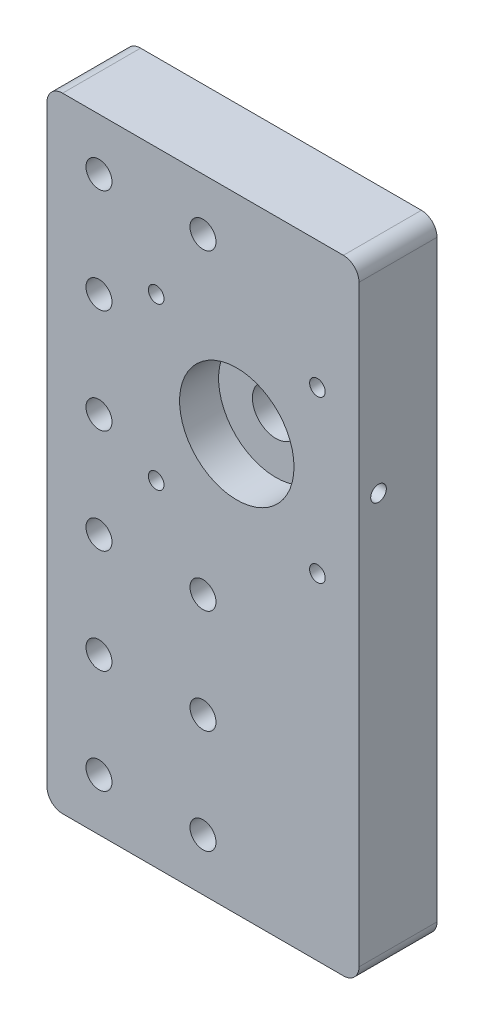
ISO-10303-21;
HEADER;
FILE_DESCRIPTION(('STEP AP214'),'2;1');
FILE_NAME('part.step','',(''),(''),'','','');
FILE_SCHEMA(('AUTOMOTIVE_DESIGN { 1 0 10303 214 1 1 1 1 }'));
ENDSEC;
DATA;
#1=APPLICATION_CONTEXT('core data for automotive mechanical design processes');
#2=APPLICATION_PROTOCOL_DEFINITION('international standard','automotive_design',2000,#1);
#3=PRODUCT_CONTEXT('',#1,'mechanical');
#4=PRODUCT('Part','Part','',(#3));
#5=PRODUCT_RELATED_PRODUCT_CATEGORY('part','',(#4));
#6=PRODUCT_DEFINITION_FORMATION('','',#4);
#7=PRODUCT_DEFINITION_CONTEXT('part definition',#1,'design');
#8=PRODUCT_DEFINITION('design','',#6,#7);
#9=PRODUCT_DEFINITION_SHAPE('','',#8);
#10=(LENGTH_UNIT() NAMED_UNIT(*) SI_UNIT(.MILLI.,.METRE.));
#11=(NAMED_UNIT(*) PLANE_ANGLE_UNIT() SI_UNIT($,.RADIAN.));
#12=(NAMED_UNIT(*) SI_UNIT($,.STERADIAN.) SOLID_ANGLE_UNIT());
#13=UNCERTAINTY_MEASURE_WITH_UNIT(LENGTH_MEASURE(1.E-05),#10,'distance_accuracy_value','');
#14=(GEOMETRIC_REPRESENTATION_CONTEXT(3) GLOBAL_UNCERTAINTY_ASSIGNED_CONTEXT((#13)) GLOBAL_UNIT_ASSIGNED_CONTEXT((#10,
#11,#12)) REPRESENTATION_CONTEXT('',''));
#15=CARTESIAN_POINT('',(0.,0.,0.));
#16=DIRECTION('',(0.,0.,1.));
#17=DIRECTION('',(1.,0.,0.));
#18=AXIS2_PLACEMENT_3D('',#15,#16,#17);
#19=CARTESIAN_POINT('',(36.5,80.,0.));
#20=DIRECTION('',(0.,0.,1.));
#21=DIRECTION('',(1.,0.,0.));
#22=AXIS2_PLACEMENT_3D('',#19,#20,#21);
#23=CYLINDRICAL_SURFACE('',#22,4.5);
#24=CARTESIAN_POINT('',(36.5,80.,0.));
#25=DIRECTION('',(0.,0.,1.));
#26=DIRECTION('',(1.,0.,0.));
#27=AXIS2_PLACEMENT_3D('',#24,#25,#26);
#28=CIRCLE('',#27,4.5);
#29=CARTESIAN_POINT('',(41.,80.,0.));
#30=VERTEX_POINT('',#29);
#31=EDGE_CURVE('E260',#30,#30,#28,.T.);
#32=ORIENTED_EDGE('',*,*,#31,.F.);
#33=EDGE_LOOP('',(#32));
#34=FACE_BOUND('',#33,.T.);
#35=CARTESIAN_POINT('',(36.5,80.,7.5));
#36=DIRECTION('',(0.,0.,1.));
#37=DIRECTION('',(1.,0.,0.));
#38=AXIS2_PLACEMENT_3D('',#35,#36,#37);
#39=CIRCLE('',#38,4.5);
#40=CARTESIAN_POINT('',(41.,80.,7.5));
#41=VERTEX_POINT('',#40);
#42=EDGE_CURVE('E454',#41,#41,#39,.T.);
#43=ORIENTED_EDGE('',*,*,#42,.T.);
#44=EDGE_LOOP('',(#43));
#45=FACE_BOUND('',#44,.T.);
#46=ADVANCED_FACE('F39',(#34,#45),#23,.F.);
#47=CARTESIAN_POINT('',(0.,0.,15.));
#48=DIRECTION('',(0.,0.,-1.));
#49=DIRECTION('',(-1.,0.,0.));
#50=AXIS2_PLACEMENT_3D('',#47,#48,#49);
#51=PLANE('',#50);
#52=CARTESIAN_POINT('',(36.5,80.,15.));
#53=DIRECTION('',(0.,0.,1.));
#54=DIRECTION('',(1.,0.,0.));
#55=AXIS2_PLACEMENT_3D('',#52,#53,#54);
#56=CIRCLE('',#55,11.);
#57=CARTESIAN_POINT('',(47.5,80.,15.));
#58=VERTEX_POINT('',#57);
#59=EDGE_CURVE('E460',#58,#58,#56,.T.);
#60=ORIENTED_EDGE('',*,*,#59,.F.);
#61=EDGE_LOOP('',(#60));
#62=FACE_BOUND('',#61,.T.);
#63=CARTESIAN_POINT('',(21.,64.5,15.));
#64=DIRECTION('',(0.,0.,1.));
#65=DIRECTION('',(1.,0.,0.));
#66=AXIS2_PLACEMENT_3D('',#63,#64,#65);
#67=CIRCLE('',#66,1.5);
#68=CARTESIAN_POINT('',(22.5,64.5,15.));
#69=VERTEX_POINT('',#68);
#70=EDGE_CURVE('E442',#69,#69,#67,.T.);
#71=ORIENTED_EDGE('',*,*,#70,.F.);
#72=EDGE_LOOP('',(#71));
#73=FACE_BOUND('',#72,.T.);
#74=CARTESIAN_POINT('',(52.,64.5,15.));
#75=DIRECTION('',(0.,0.,1.));
#76=DIRECTION('',(1.,0.,0.));
#77=AXIS2_PLACEMENT_3D('',#74,#75,#76);
#78=CIRCLE('',#77,1.5);
#79=CARTESIAN_POINT('',(53.5,64.5,15.));
#80=VERTEX_POINT('',#79);
#81=EDGE_CURVE('E432',#80,#80,#78,.T.);
#82=ORIENTED_EDGE('',*,*,#81,.F.);
#83=EDGE_LOOP('',(#82));
#84=FACE_BOUND('',#83,.T.);
#85=CARTESIAN_POINT('',(21.,95.5,15.));
#86=DIRECTION('',(0.,0.,1.));
#87=DIRECTION('',(1.,0.,0.));
#88=AXIS2_PLACEMENT_3D('',#85,#86,#87);
#89=CIRCLE('',#88,1.5);
#90=CARTESIAN_POINT('',(22.5,95.5,15.));
#91=VERTEX_POINT('',#90);
#92=EDGE_CURVE('E440',#91,#91,#89,.T.);
#93=ORIENTED_EDGE('',*,*,#92,.F.);
#94=EDGE_LOOP('',(#93));
#95=FACE_BOUND('',#94,.T.);
#96=CARTESIAN_POINT('',(52.,95.5,15.));
#97=DIRECTION('',(0.,0.,1.));
#98=DIRECTION('',(1.,0.,0.));
#99=AXIS2_PLACEMENT_3D('',#96,#97,#98);
#100=CIRCLE('',#99,1.5);
#101=CARTESIAN_POINT('',(53.5,95.5,15.));
#102=VERTEX_POINT('',#101);
#103=EDGE_CURVE('E468',#102,#102,#100,.T.);
#104=ORIENTED_EDGE('',*,*,#103,.F.);
#105=EDGE_LOOP('',(#104));
#106=FACE_BOUND('',#105,.T.);
#107=DIRECTION('',(0.,-1.,0.));
#108=VECTOR('',#107,1.);
#109=CARTESIAN_POINT('',(0.,0.,15.));
#110=LINE('',#109,#108);
#111=CARTESIAN_POINT('',(0.,117.,15.));
#112=VERTEX_POINT('',#111);
#113=CARTESIAN_POINT('',(0.,3.,15.));
#114=VERTEX_POINT('',#113);
#115=EDGE_CURVE('E149',#112,#114,#110,.T.);
#116=ORIENTED_EDGE('',*,*,#115,.T.);
#117=CARTESIAN_POINT('',(3.,3.,15.));
#118=DIRECTION('',(0.,0.,-1.));
#119=DIRECTION('',(-1.,0.,0.));
#120=AXIS2_PLACEMENT_3D('',#117,#118,#119);
#121=CIRCLE('',#120,3.);
#122=CARTESIAN_POINT('',(3.,0.,15.));
#123=VERTEX_POINT('',#122);
#124=EDGE_CURVE('E173',#114,#123,#121,.F.);
#125=ORIENTED_EDGE('',*,*,#124,.T.);
#126=DIRECTION('',(1.,0.,0.));
#127=VECTOR('',#126,1.);
#128=CARTESIAN_POINT('',(0.,0.,15.));
#129=LINE('',#128,#127);
#130=CARTESIAN_POINT('',(57.,0.,15.));
#131=VERTEX_POINT('',#130);
#132=EDGE_CURVE('E126',#123,#131,#129,.T.);
#133=ORIENTED_EDGE('',*,*,#132,.T.);
#134=CARTESIAN_POINT('',(57.,3.,15.));
#135=DIRECTION('',(0.,0.,-1.));
#136=DIRECTION('',(-1.,0.,0.));
#137=AXIS2_PLACEMENT_3D('',#134,#135,#136);
#138=CIRCLE('',#137,3.);
#139=CARTESIAN_POINT('',(60.,3.,15.));
#140=VERTEX_POINT('',#139);
#141=EDGE_CURVE('E170',#131,#140,#138,.F.);
#142=ORIENTED_EDGE('',*,*,#141,.T.);
#143=DIRECTION('',(0.,1.,0.));
#144=VECTOR('',#143,1.);
#145=CARTESIAN_POINT('',(60.,0.,15.));
#146=LINE('',#145,#144);
#147=CARTESIAN_POINT('',(60.,117.,15.));
#148=VERTEX_POINT('',#147);
#149=EDGE_CURVE('E199',#140,#148,#146,.T.);
#150=ORIENTED_EDGE('',*,*,#149,.T.);
#151=CARTESIAN_POINT('',(57.,117.,15.));
#152=DIRECTION('',(0.,0.,-1.));
#153=DIRECTION('',(-1.,0.,0.));
#154=AXIS2_PLACEMENT_3D('',#151,#152,#153);
#155=CIRCLE('',#154,3.);
#156=CARTESIAN_POINT('',(57.,120.,15.));
#157=VERTEX_POINT('',#156);
#158=EDGE_CURVE('E60',#148,#157,#155,.F.);
#159=ORIENTED_EDGE('',*,*,#158,.T.);
#160=DIRECTION('',(-1.,0.,0.));
#161=VECTOR('',#160,1.);
#162=CARTESIAN_POINT('',(0.,120.,15.));
#163=LINE('',#162,#161);
#164=CARTESIAN_POINT('',(3.,120.,15.));
#165=VERTEX_POINT('',#164);
#166=EDGE_CURVE('E151',#157,#165,#163,.T.);
#167=ORIENTED_EDGE('',*,*,#166,.T.);
#168=CARTESIAN_POINT('',(3.,117.,15.));
#169=DIRECTION('',(0.,0.,-1.));
#170=DIRECTION('',(-1.,0.,0.));
#171=AXIS2_PLACEMENT_3D('',#168,#169,#170);
#172=CIRCLE('',#171,3.);
#173=EDGE_CURVE('E167',#165,#112,#172,.F.);
#174=ORIENTED_EDGE('',*,*,#173,.T.);
#175=EDGE_LOOP('',(#116,#125,#133,#142,#150,#159,#167,#174));
#176=FACE_BOUND('',#175,.T.);
#177=CARTESIAN_POINT('',(10.,110.,15.));
#178=DIRECTION('',(0.,0.,1.));
#179=DIRECTION('',(1.,0.,0.));
#180=AXIS2_PLACEMENT_3D('',#177,#178,#179);
#181=CIRCLE('',#180,2.5);
#182=CARTESIAN_POINT('',(12.5,110.,15.));
#183=VERTEX_POINT('',#182);
#184=EDGE_CURVE('E143',#183,#183,#181,.T.);
#185=ORIENTED_EDGE('',*,*,#184,.F.);
#186=EDGE_LOOP('',(#185));
#187=FACE_BOUND('',#186,.T.);
#188=CARTESIAN_POINT('',(30.,110.,15.));
#189=DIRECTION('',(0.,0.,1.));
#190=DIRECTION('',(1.,0.,0.));
#191=AXIS2_PLACEMENT_3D('',#188,#189,#190);
#192=CIRCLE('',#191,2.5);
#193=CARTESIAN_POINT('',(32.5,110.,15.));
#194=VERTEX_POINT('',#193);
#195=EDGE_CURVE('E218',#194,#194,#192,.T.);
#196=ORIENTED_EDGE('',*,*,#195,.F.);
#197=EDGE_LOOP('',(#196));
#198=FACE_BOUND('',#197,.T.);
#199=CARTESIAN_POINT('',(10.,90.,15.));
#200=DIRECTION('',(0.,0.,1.));
#201=DIRECTION('',(1.,0.,0.));
#202=AXIS2_PLACEMENT_3D('',#199,#200,#201);
#203=CIRCLE('',#202,2.5);
#204=CARTESIAN_POINT('',(12.5,90.,15.));
#205=VERTEX_POINT('',#204);
#206=EDGE_CURVE('E222',#205,#205,#203,.T.);
#207=ORIENTED_EDGE('',*,*,#206,.F.);
#208=EDGE_LOOP('',(#207));
#209=FACE_BOUND('',#208,.T.);
#210=CARTESIAN_POINT('',(10.,70.,15.));
#211=DIRECTION('',(0.,0.,1.));
#212=DIRECTION('',(1.,0.,0.));
#213=AXIS2_PLACEMENT_3D('',#210,#211,#212);
#214=CIRCLE('',#213,2.5);
#215=CARTESIAN_POINT('',(12.5,70.,15.));
#216=VERTEX_POINT('',#215);
#217=EDGE_CURVE('E226',#216,#216,#214,.T.);
#218=ORIENTED_EDGE('',*,*,#217,.F.);
#219=EDGE_LOOP('',(#218));
#220=FACE_BOUND('',#219,.T.);
#221=CARTESIAN_POINT('',(10.,30.,15.));
#222=DIRECTION('',(0.,0.,1.));
#223=DIRECTION('',(1.,0.,0.));
#224=AXIS2_PLACEMENT_3D('',#221,#222,#223);
#225=CIRCLE('',#224,2.5);
#226=CARTESIAN_POINT('',(12.5,30.,15.));
#227=VERTEX_POINT('',#226);
#228=EDGE_CURVE('E230',#227,#227,#225,.T.);
#229=ORIENTED_EDGE('',*,*,#228,.F.);
#230=EDGE_LOOP('',(#229));
#231=FACE_BOUND('',#230,.T.);
#232=CARTESIAN_POINT('',(10.,10.,15.));
#233=DIRECTION('',(0.,0.,1.));
#234=DIRECTION('',(1.,0.,0.));
#235=AXIS2_PLACEMENT_3D('',#232,#233,#234);
#236=CIRCLE('',#235,2.5);
#237=CARTESIAN_POINT('',(12.5,10.,15.));
#238=VERTEX_POINT('',#237);
#239=EDGE_CURVE('E234',#238,#238,#236,.T.);
#240=ORIENTED_EDGE('',*,*,#239,.F.);
#241=EDGE_LOOP('',(#240));
#242=FACE_BOUND('',#241,.T.);
#243=CARTESIAN_POINT('',(30.,10.,15.));
#244=DIRECTION('',(0.,0.,1.));
#245=DIRECTION('',(1.,0.,0.));
#246=AXIS2_PLACEMENT_3D('',#243,#244,#245);
#247=CIRCLE('',#246,2.5);
#248=CARTESIAN_POINT('',(32.5,10.,15.));
#249=VERTEX_POINT('',#248);
#250=EDGE_CURVE('E238',#249,#249,#247,.T.);
#251=ORIENTED_EDGE('',*,*,#250,.F.);
#252=EDGE_LOOP('',(#251));
#253=FACE_BOUND('',#252,.T.);
#254=CARTESIAN_POINT('',(10.,50.,15.));
#255=DIRECTION('',(0.,0.,1.));
#256=DIRECTION('',(1.,0.,0.));
#257=AXIS2_PLACEMENT_3D('',#254,#255,#256);
#258=CIRCLE('',#257,2.5);
#259=CARTESIAN_POINT('',(12.5,50.,15.));
#260=VERTEX_POINT('',#259);
#261=EDGE_CURVE('E242',#260,#260,#258,.T.);
#262=ORIENTED_EDGE('',*,*,#261,.F.);
#263=EDGE_LOOP('',(#262));
#264=FACE_BOUND('',#263,.T.);
#265=CARTESIAN_POINT('',(30.,50.,15.));
#266=DIRECTION('',(0.,0.,1.));
#267=DIRECTION('',(1.,0.,0.));
#268=AXIS2_PLACEMENT_3D('',#265,#266,#267);
#269=CIRCLE('',#268,2.5);
#270=CARTESIAN_POINT('',(32.5,50.,15.));
#271=VERTEX_POINT('',#270);
#272=EDGE_CURVE('E246',#271,#271,#269,.T.);
#273=ORIENTED_EDGE('',*,*,#272,.F.);
#274=EDGE_LOOP('',(#273));
#275=FACE_BOUND('',#274,.T.);
#276=CARTESIAN_POINT('',(30.,30.,15.));
#277=DIRECTION('',(0.,0.,1.));
#278=DIRECTION('',(1.,0.,0.));
#279=AXIS2_PLACEMENT_3D('',#276,#277,#278);
#280=CIRCLE('',#279,2.5);
#281=CARTESIAN_POINT('',(32.5,30.,15.));
#282=VERTEX_POINT('',#281);
#283=EDGE_CURVE('E249',#282,#282,#280,.T.);
#284=ORIENTED_EDGE('',*,*,#283,.F.);
#285=EDGE_LOOP('',(#284));
#286=FACE_BOUND('',#285,.T.);
#287=ADVANCED_FACE('F207',(#62,#73,#84,#95,#106,#176,#187,#198,#209,#220,#231,#242,#253,#264,
#275,#286),#51,.F.);
#288=CARTESIAN_POINT('',(0.,0.,0.));
#289=DIRECTION('',(0.,0.,-1.));
#290=DIRECTION('',(-1.,0.,0.));
#291=AXIS2_PLACEMENT_3D('',#288,#289,#290);
#292=PLANE('',#291);
#293=CARTESIAN_POINT('',(21.,64.5,0.));
#294=DIRECTION('',(0.,0.,1.));
#295=DIRECTION('',(1.,0.,0.));
#296=AXIS2_PLACEMENT_3D('',#293,#294,#295);
#297=CIRCLE('',#296,1.5);
#298=CARTESIAN_POINT('',(22.5,64.5,0.));
#299=VERTEX_POINT('',#298);
#300=EDGE_CURVE('E448',#299,#299,#297,.T.);
#301=ORIENTED_EDGE('',*,*,#300,.T.);
#302=EDGE_LOOP('',(#301));
#303=FACE_BOUND('',#302,.T.);
#304=CARTESIAN_POINT('',(52.,64.5,0.));
#305=DIRECTION('',(0.,0.,1.));
#306=DIRECTION('',(1.,0.,0.));
#307=AXIS2_PLACEMENT_3D('',#304,#305,#306);
#308=CIRCLE('',#307,1.5);
#309=CARTESIAN_POINT('',(53.5,64.5,0.));
#310=VERTEX_POINT('',#309);
#311=EDGE_CURVE('E429',#310,#310,#308,.T.);
#312=ORIENTED_EDGE('',*,*,#311,.T.);
#313=EDGE_LOOP('',(#312));
#314=FACE_BOUND('',#313,.T.);
#315=CARTESIAN_POINT('',(21.,95.5,0.));
#316=DIRECTION('',(0.,0.,1.));
#317=DIRECTION('',(1.,0.,0.));
#318=AXIS2_PLACEMENT_3D('',#315,#316,#317);
#319=CIRCLE('',#318,1.5);
#320=CARTESIAN_POINT('',(22.5,95.5,0.));
#321=VERTEX_POINT('',#320);
#322=EDGE_CURVE('E435',#321,#321,#319,.T.);
#323=ORIENTED_EDGE('',*,*,#322,.T.);
#324=EDGE_LOOP('',(#323));
#325=FACE_BOUND('',#324,.T.);
#326=CARTESIAN_POINT('',(52.,95.5,0.));
#327=DIRECTION('',(0.,0.,1.));
#328=DIRECTION('',(1.,0.,0.));
#329=AXIS2_PLACEMENT_3D('',#326,#327,#328);
#330=CIRCLE('',#329,1.5);
#331=CARTESIAN_POINT('',(53.5,95.5,0.));
#332=VERTEX_POINT('',#331);
#333=EDGE_CURVE('E472',#332,#332,#330,.T.);
#334=ORIENTED_EDGE('',*,*,#333,.T.);
#335=EDGE_LOOP('',(#334));
#336=FACE_BOUND('',#335,.T.);
#337=ORIENTED_EDGE('',*,*,#31,.T.);
#338=EDGE_LOOP('',(#337));
#339=FACE_BOUND('',#338,.T.);
#340=CARTESIAN_POINT('',(30.,50.,0.));
#341=DIRECTION('',(0.,0.,1.));
#342=DIRECTION('',(1.,0.,0.));
#343=AXIS2_PLACEMENT_3D('',#340,#341,#342);
#344=CIRCLE('',#343,2.5);
#345=CARTESIAN_POINT('',(32.5,50.,0.));
#346=VERTEX_POINT('',#345);
#347=EDGE_CURVE('E252',#346,#346,#344,.T.);
#348=ORIENTED_EDGE('',*,*,#347,.T.);
#349=EDGE_LOOP('',(#348));
#350=FACE_BOUND('',#349,.T.);
#351=CARTESIAN_POINT('',(30.,10.,0.));
#352=DIRECTION('',(0.,0.,1.));
#353=DIRECTION('',(1.,0.,0.));
#354=AXIS2_PLACEMENT_3D('',#351,#352,#353);
#355=CIRCLE('',#354,2.5);
#356=CARTESIAN_POINT('',(32.5,10.,0.));
#357=VERTEX_POINT('',#356);
#358=EDGE_CURVE('E270',#357,#357,#355,.T.);
#359=ORIENTED_EDGE('',*,*,#358,.T.);
#360=EDGE_LOOP('',(#359));
#361=FACE_BOUND('',#360,.T.);
#362=CARTESIAN_POINT('',(10.,30.,0.));
#363=DIRECTION('',(0.,0.,1.));
#364=DIRECTION('',(1.,0.,0.));
#365=AXIS2_PLACEMENT_3D('',#362,#363,#364);
#366=CIRCLE('',#365,2.5);
#367=CARTESIAN_POINT('',(12.5,30.,0.));
#368=VERTEX_POINT('',#367);
#369=EDGE_CURVE('E282',#368,#368,#366,.T.);
#370=ORIENTED_EDGE('',*,*,#369,.T.);
#371=EDGE_LOOP('',(#370));
#372=FACE_BOUND('',#371,.T.);
#373=CARTESIAN_POINT('',(10.,90.,0.));
#374=DIRECTION('',(0.,0.,1.));
#375=DIRECTION('',(1.,0.,0.));
#376=AXIS2_PLACEMENT_3D('',#373,#374,#375);
#377=CIRCLE('',#376,2.5);
#378=CARTESIAN_POINT('',(12.5,90.,0.));
#379=VERTEX_POINT('',#378);
#380=EDGE_CURVE('E294',#379,#379,#377,.T.);
#381=ORIENTED_EDGE('',*,*,#380,.T.);
#382=EDGE_LOOP('',(#381));
#383=FACE_BOUND('',#382,.T.);
#384=CARTESIAN_POINT('',(10.,110.,0.));
#385=DIRECTION('',(0.,0.,1.));
#386=DIRECTION('',(1.,0.,0.));
#387=AXIS2_PLACEMENT_3D('',#384,#385,#386);
#388=CIRCLE('',#387,2.5);
#389=CARTESIAN_POINT('',(12.5,110.,0.));
#390=VERTEX_POINT('',#389);
#391=EDGE_CURVE('E202',#390,#390,#388,.T.);
#392=ORIENTED_EDGE('',*,*,#391,.T.);
#393=EDGE_LOOP('',(#392));
#394=FACE_BOUND('',#393,.T.);
#395=DIRECTION('',(1.,0.,0.));
#396=VECTOR('',#395,1.);
#397=CARTESIAN_POINT('',(0.,0.,0.));
#398=LINE('',#397,#396);
#399=CARTESIAN_POINT('',(3.,0.,0.));
#400=VERTEX_POINT('',#399);
#401=CARTESIAN_POINT('',(57.,0.,0.));
#402=VERTEX_POINT('',#401);
#403=EDGE_CURVE('E123',#400,#402,#398,.T.);
#404=ORIENTED_EDGE('',*,*,#403,.F.);
#405=CARTESIAN_POINT('',(3.,3.,0.));
#406=DIRECTION('',(0.,0.,-1.));
#407=DIRECTION('',(-1.,0.,0.));
#408=AXIS2_PLACEMENT_3D('',#405,#406,#407);
#409=CIRCLE('',#408,3.);
#410=CARTESIAN_POINT('',(0.,3.,0.));
#411=VERTEX_POINT('',#410);
#412=EDGE_CURVE('E105',#400,#411,#409,.T.);
#413=ORIENTED_EDGE('',*,*,#412,.T.);
#414=DIRECTION('',(0.,-1.,0.));
#415=VECTOR('',#414,1.);
#416=CARTESIAN_POINT('',(0.,0.,0.));
#417=LINE('',#416,#415);
#418=CARTESIAN_POINT('',(0.,117.,0.));
#419=VERTEX_POINT('',#418);
#420=EDGE_CURVE('E136',#419,#411,#417,.T.);
#421=ORIENTED_EDGE('',*,*,#420,.F.);
#422=CARTESIAN_POINT('',(3.,117.,0.));
#423=DIRECTION('',(0.,0.,-1.));
#424=DIRECTION('',(-1.,0.,0.));
#425=AXIS2_PLACEMENT_3D('',#422,#423,#424);
#426=CIRCLE('',#425,3.);
#427=CARTESIAN_POINT('',(3.,120.,0.));
#428=VERTEX_POINT('',#427);
#429=EDGE_CURVE('E155',#419,#428,#426,.T.);
#430=ORIENTED_EDGE('',*,*,#429,.T.);
#431=DIRECTION('',(-1.,0.,0.));
#432=VECTOR('',#431,1.);
#433=CARTESIAN_POINT('',(0.,120.,0.));
#434=LINE('',#433,#432);
#435=CARTESIAN_POINT('',(57.,120.,0.));
#436=VERTEX_POINT('',#435);
#437=EDGE_CURVE('E141',#436,#428,#434,.T.);
#438=ORIENTED_EDGE('',*,*,#437,.F.);
#439=CARTESIAN_POINT('',(57.,117.,0.));
#440=DIRECTION('',(0.,0.,-1.));
#441=DIRECTION('',(-1.,0.,0.));
#442=AXIS2_PLACEMENT_3D('',#439,#440,#441);
#443=CIRCLE('',#442,3.);
#444=CARTESIAN_POINT('',(60.,117.,0.));
#445=VERTEX_POINT('',#444);
#446=EDGE_CURVE('E128',#436,#445,#443,.T.);
#447=ORIENTED_EDGE('',*,*,#446,.T.);
#448=DIRECTION('',(0.,1.,0.));
#449=VECTOR('',#448,1.);
#450=CARTESIAN_POINT('',(60.,0.,0.));
#451=LINE('',#450,#449);
#452=CARTESIAN_POINT('',(60.,3.,0.));
#453=VERTEX_POINT('',#452);
#454=EDGE_CURVE('E135',#453,#445,#451,.T.);
#455=ORIENTED_EDGE('',*,*,#454,.F.);
#456=CARTESIAN_POINT('',(57.,3.,0.));
#457=DIRECTION('',(0.,0.,-1.));
#458=DIRECTION('',(-1.,0.,0.));
#459=AXIS2_PLACEMENT_3D('',#456,#457,#458);
#460=CIRCLE('',#459,3.);
#461=EDGE_CURVE('E117',#453,#402,#460,.T.);
#462=ORIENTED_EDGE('',*,*,#461,.T.);
#463=EDGE_LOOP('',(#404,#413,#421,#430,#438,#447,#455,#462));
#464=FACE_BOUND('',#463,.T.);
#465=CARTESIAN_POINT('',(30.,110.,0.));
#466=DIRECTION('',(0.,0.,1.));
#467=DIRECTION('',(1.,0.,0.));
#468=AXIS2_PLACEMENT_3D('',#465,#466,#467);
#469=CIRCLE('',#468,2.5);
#470=CARTESIAN_POINT('',(32.5,110.,0.));
#471=VERTEX_POINT('',#470);
#472=EDGE_CURVE('E300',#471,#471,#469,.T.);
#473=ORIENTED_EDGE('',*,*,#472,.T.);
#474=EDGE_LOOP('',(#473));
#475=FACE_BOUND('',#474,.T.);
#476=CARTESIAN_POINT('',(10.,70.,0.));
#477=DIRECTION('',(0.,0.,1.));
#478=DIRECTION('',(1.,0.,0.));
#479=AXIS2_PLACEMENT_3D('',#476,#477,#478);
#480=CIRCLE('',#479,2.5);
#481=CARTESIAN_POINT('',(12.5,70.,0.));
#482=VERTEX_POINT('',#481);
#483=EDGE_CURVE('E288',#482,#482,#480,.T.);
#484=ORIENTED_EDGE('',*,*,#483,.T.);
#485=EDGE_LOOP('',(#484));
#486=FACE_BOUND('',#485,.T.);
#487=CARTESIAN_POINT('',(10.,10.,0.));
#488=DIRECTION('',(0.,0.,1.));
#489=DIRECTION('',(1.,0.,0.));
#490=AXIS2_PLACEMENT_3D('',#487,#488,#489);
#491=CIRCLE('',#490,2.5);
#492=CARTESIAN_POINT('',(12.5,10.,0.));
#493=VERTEX_POINT('',#492);
#494=EDGE_CURVE('E276',#493,#493,#491,.T.);
#495=ORIENTED_EDGE('',*,*,#494,.T.);
#496=EDGE_LOOP('',(#495));
#497=FACE_BOUND('',#496,.T.);
#498=CARTESIAN_POINT('',(10.,50.,0.));
#499=DIRECTION('',(0.,0.,1.));
#500=DIRECTION('',(1.,0.,0.));
#501=AXIS2_PLACEMENT_3D('',#498,#499,#500);
#502=CIRCLE('',#501,2.5);
#503=CARTESIAN_POINT('',(12.5,50.,0.));
#504=VERTEX_POINT('',#503);
#505=EDGE_CURVE('E266',#504,#504,#502,.T.);
#506=ORIENTED_EDGE('',*,*,#505,.T.);
#507=EDGE_LOOP('',(#506));
#508=FACE_BOUND('',#507,.T.);
#509=CARTESIAN_POINT('',(30.,30.,0.));
#510=DIRECTION('',(0.,0.,1.));
#511=DIRECTION('',(1.,0.,0.));
#512=AXIS2_PLACEMENT_3D('',#509,#510,#511);
#513=CIRCLE('',#512,2.5);
#514=CARTESIAN_POINT('',(32.5,30.,0.));
#515=VERTEX_POINT('',#514);
#516=EDGE_CURVE('E253',#515,#515,#513,.T.);
#517=ORIENTED_EDGE('',*,*,#516,.T.);
#518=EDGE_LOOP('',(#517));
#519=FACE_BOUND('',#518,.T.);
#520=ADVANCED_FACE('F131',(#303,#314,#325,#336,#339,#350,#361,#372,#383,#394,#464,#475,#486,
#497,#508,#519),#292,.T.);
#521=CARTESIAN_POINT('',(0.,0.,15.));
#522=DIRECTION('',(1.,0.,0.));
#523=DIRECTION('',(0.,0.,-1.));
#524=AXIS2_PLACEMENT_3D('',#521,#522,#523);
#525=PLANE('',#524);
#526=ORIENTED_EDGE('',*,*,#420,.T.);
#527=DIRECTION('',(0.,0.,-1.));
#528=VECTOR('',#527,1.);
#529=CARTESIAN_POINT('',(0.,3.,15.));
#530=LINE('',#529,#528);
#531=EDGE_CURVE('E110',#411,#114,#530,.F.);
#532=ORIENTED_EDGE('',*,*,#531,.T.);
#533=ORIENTED_EDGE('',*,*,#115,.F.);
#534=DIRECTION('',(0.,0.,-1.));
#535=VECTOR('',#534,1.);
#536=CARTESIAN_POINT('',(0.,117.,15.));
#537=LINE('',#536,#535);
#538=EDGE_CURVE('E116',#112,#419,#537,.T.);
#539=ORIENTED_EDGE('',*,*,#538,.T.);
#540=EDGE_LOOP('',(#526,#532,#533,#539));
#541=FACE_BOUND('',#540,.T.);
#542=ADVANCED_FACE('F194',(#541),#525,.F.);
#543=CARTESIAN_POINT('',(0.,0.,15.));
#544=DIRECTION('',(0.,1.,0.));
#545=DIRECTION('',(0.,0.,1.));
#546=AXIS2_PLACEMENT_3D('',#543,#544,#545);
#547=PLANE('',#546);
#548=ORIENTED_EDGE('',*,*,#132,.F.);
#549=DIRECTION('',(0.,0.,-1.));
#550=VECTOR('',#549,1.);
#551=CARTESIAN_POINT('',(3.,0.,15.));
#552=LINE('',#551,#550);
#553=EDGE_CURVE('E109',#123,#400,#552,.T.);
#554=ORIENTED_EDGE('',*,*,#553,.T.);
#555=ORIENTED_EDGE('',*,*,#403,.T.);
#556=DIRECTION('',(0.,0.,-1.));
#557=VECTOR('',#556,1.);
#558=CARTESIAN_POINT('',(57.,0.,15.));
#559=LINE('',#558,#557);
#560=EDGE_CURVE('E129',#402,#131,#559,.F.);
#561=ORIENTED_EDGE('',*,*,#560,.T.);
#562=EDGE_LOOP('',(#548,#554,#555,#561));
#563=FACE_BOUND('',#562,.T.);
#564=ADVANCED_FACE('F122',(#563),#547,.F.);
#565=CARTESIAN_POINT('',(60.,0.,15.));
#566=DIRECTION('',(-1.,0.,0.));
#567=DIRECTION('',(0.,0.,1.));
#568=AXIS2_PLACEMENT_3D('',#565,#566,#567);
#569=PLANE('',#568);
#570=CARTESIAN_POINT('',(60.,80.,11.25));
#571=DIRECTION('',(1.,0.,0.));
#572=DIRECTION('',(0.,0.,-1.));
#573=AXIS2_PLACEMENT_3D('',#570,#571,#572);
#574=CIRCLE('',#573,1.5);
#575=CARTESIAN_POINT('',(60.,80.,9.75));
#576=VERTEX_POINT('',#575);
#577=EDGE_CURVE('E467',#576,#576,#574,.T.);
#578=ORIENTED_EDGE('',*,*,#577,.F.);
#579=EDGE_LOOP('',(#578));
#580=FACE_BOUND('',#579,.T.);
#581=ORIENTED_EDGE('',*,*,#149,.F.);
#582=DIRECTION('',(0.,0.,-1.));
#583=VECTOR('',#582,1.);
#584=CARTESIAN_POINT('',(60.,3.,15.));
#585=LINE('',#584,#583);
#586=EDGE_CURVE('E179',#140,#453,#585,.T.);
#587=ORIENTED_EDGE('',*,*,#586,.T.);
#588=ORIENTED_EDGE('',*,*,#454,.T.);
#589=DIRECTION('',(0.,0.,-1.));
#590=VECTOR('',#589,1.);
#591=CARTESIAN_POINT('',(60.,117.,15.));
#592=LINE('',#591,#590);
#593=EDGE_CURVE('E176',#445,#148,#592,.F.);
#594=ORIENTED_EDGE('',*,*,#593,.T.);
#595=EDGE_LOOP('',(#581,#587,#588,#594));
#596=FACE_BOUND('',#595,.T.);
#597=ADVANCED_FACE('F326',(#580,#596),#569,.F.);
#598=CARTESIAN_POINT('',(0.,120.,15.));
#599=DIRECTION('',(0.,-1.,0.));
#600=DIRECTION('',(0.,0.,-1.));
#601=AXIS2_PLACEMENT_3D('',#598,#599,#600);
#602=PLANE('',#601);
#603=ORIENTED_EDGE('',*,*,#437,.T.);
#604=DIRECTION('',(0.,0.,-1.));
#605=VECTOR('',#604,1.);
#606=CARTESIAN_POINT('',(3.,120.,15.));
#607=LINE('',#606,#605);
#608=EDGE_CURVE('E11',#428,#165,#607,.F.);
#609=ORIENTED_EDGE('',*,*,#608,.T.);
#610=ORIENTED_EDGE('',*,*,#166,.F.);
#611=DIRECTION('',(0.,0.,-1.));
#612=VECTOR('',#611,1.);
#613=CARTESIAN_POINT('',(57.,120.,15.));
#614=LINE('',#613,#612);
#615=EDGE_CURVE('E48',#157,#436,#614,.T.);
#616=ORIENTED_EDGE('',*,*,#615,.T.);
#617=EDGE_LOOP('',(#603,#609,#610,#616));
#618=FACE_BOUND('',#617,.T.);
#619=ADVANCED_FACE('F186',(#618),#602,.F.);
#620=CARTESIAN_POINT('',(10.,110.,15.));
#621=DIRECTION('',(0.,0.,-1.));
#622=DIRECTION('',(-1.,0.,0.));
#623=AXIS2_PLACEMENT_3D('',#620,#621,#622);
#624=CYLINDRICAL_SURFACE('',#623,2.5);
#625=ORIENTED_EDGE('',*,*,#184,.T.);
#626=EDGE_LOOP('',(#625));
#627=FACE_BOUND('',#626,.T.);
#628=ORIENTED_EDGE('',*,*,#391,.F.);
#629=EDGE_LOOP('',(#628));
#630=FACE_BOUND('',#629,.T.);
#631=ADVANCED_FACE('F315',(#627,#630),#624,.F.);
#632=CARTESIAN_POINT('',(30.,110.,15.));
#633=DIRECTION('',(0.,0.,-1.));
#634=DIRECTION('',(-1.,0.,0.));
#635=AXIS2_PLACEMENT_3D('',#632,#633,#634);
#636=CYLINDRICAL_SURFACE('',#635,2.5);
#637=ORIENTED_EDGE('',*,*,#195,.T.);
#638=EDGE_LOOP('',(#637));
#639=FACE_BOUND('',#638,.T.);
#640=ORIENTED_EDGE('',*,*,#472,.F.);
#641=EDGE_LOOP('',(#640));
#642=FACE_BOUND('',#641,.T.);
#643=ADVANCED_FACE('F317',(#639,#642),#636,.F.);
#644=CARTESIAN_POINT('',(10.,90.,15.));
#645=DIRECTION('',(0.,0.,-1.));
#646=DIRECTION('',(-1.,0.,0.));
#647=AXIS2_PLACEMENT_3D('',#644,#645,#646);
#648=CYLINDRICAL_SURFACE('',#647,2.5);
#649=ORIENTED_EDGE('',*,*,#206,.T.);
#650=EDGE_LOOP('',(#649));
#651=FACE_BOUND('',#650,.T.);
#652=ORIENTED_EDGE('',*,*,#380,.F.);
#653=EDGE_LOOP('',(#652));
#654=FACE_BOUND('',#653,.T.);
#655=ADVANCED_FACE('F323',(#651,#654),#648,.F.);
#656=CARTESIAN_POINT('',(10.,70.,15.));
#657=DIRECTION('',(0.,0.,-1.));
#658=DIRECTION('',(-1.,0.,0.));
#659=AXIS2_PLACEMENT_3D('',#656,#657,#658);
#660=CYLINDRICAL_SURFACE('',#659,2.5);
#661=ORIENTED_EDGE('',*,*,#217,.T.);
#662=EDGE_LOOP('',(#661));
#663=FACE_BOUND('',#662,.T.);
#664=ORIENTED_EDGE('',*,*,#483,.F.);
#665=EDGE_LOOP('',(#664));
#666=FACE_BOUND('',#665,.T.);
#667=ADVANCED_FACE('F361',(#663,#666),#660,.F.);
#668=CARTESIAN_POINT('',(10.,30.,15.));
#669=DIRECTION('',(0.,0.,-1.));
#670=DIRECTION('',(-1.,0.,0.));
#671=AXIS2_PLACEMENT_3D('',#668,#669,#670);
#672=CYLINDRICAL_SURFACE('',#671,2.5);
#673=ORIENTED_EDGE('',*,*,#228,.T.);
#674=EDGE_LOOP('',(#673));
#675=FACE_BOUND('',#674,.T.);
#676=ORIENTED_EDGE('',*,*,#369,.F.);
#677=EDGE_LOOP('',(#676));
#678=FACE_BOUND('',#677,.T.);
#679=ADVANCED_FACE('F357',(#675,#678),#672,.F.);
#680=CARTESIAN_POINT('',(10.,10.,15.));
#681=DIRECTION('',(0.,0.,-1.));
#682=DIRECTION('',(-1.,0.,0.));
#683=AXIS2_PLACEMENT_3D('',#680,#681,#682);
#684=CYLINDRICAL_SURFACE('',#683,2.5);
#685=ORIENTED_EDGE('',*,*,#239,.T.);
#686=EDGE_LOOP('',(#685));
#687=FACE_BOUND('',#686,.T.);
#688=ORIENTED_EDGE('',*,*,#494,.F.);
#689=EDGE_LOOP('',(#688));
#690=FACE_BOUND('',#689,.T.);
#691=ADVANCED_FACE('F353',(#687,#690),#684,.F.);
#692=CARTESIAN_POINT('',(30.,10.,15.));
#693=DIRECTION('',(0.,0.,-1.));
#694=DIRECTION('',(-1.,0.,0.));
#695=AXIS2_PLACEMENT_3D('',#692,#693,#694);
#696=CYLINDRICAL_SURFACE('',#695,2.5);
#697=ORIENTED_EDGE('',*,*,#250,.T.);
#698=EDGE_LOOP('',(#697));
#699=FACE_BOUND('',#698,.T.);
#700=ORIENTED_EDGE('',*,*,#358,.F.);
#701=EDGE_LOOP('',(#700));
#702=FACE_BOUND('',#701,.T.);
#703=ADVANCED_FACE('F349',(#699,#702),#696,.F.);
#704=CARTESIAN_POINT('',(10.,50.,15.));
#705=DIRECTION('',(0.,0.,-1.));
#706=DIRECTION('',(-1.,0.,0.));
#707=AXIS2_PLACEMENT_3D('',#704,#705,#706);
#708=CYLINDRICAL_SURFACE('',#707,2.5);
#709=ORIENTED_EDGE('',*,*,#261,.T.);
#710=EDGE_LOOP('',(#709));
#711=FACE_BOUND('',#710,.T.);
#712=ORIENTED_EDGE('',*,*,#505,.F.);
#713=EDGE_LOOP('',(#712));
#714=FACE_BOUND('',#713,.T.);
#715=ADVANCED_FACE('F345',(#711,#714),#708,.F.);
#716=CARTESIAN_POINT('',(30.,50.,15.));
#717=DIRECTION('',(0.,0.,-1.));
#718=DIRECTION('',(-1.,0.,0.));
#719=AXIS2_PLACEMENT_3D('',#716,#717,#718);
#720=CYLINDRICAL_SURFACE('',#719,2.5);
#721=ORIENTED_EDGE('',*,*,#272,.T.);
#722=EDGE_LOOP('',(#721));
#723=FACE_BOUND('',#722,.T.);
#724=ORIENTED_EDGE('',*,*,#347,.F.);
#725=EDGE_LOOP('',(#724));
#726=FACE_BOUND('',#725,.T.);
#727=ADVANCED_FACE('F342',(#723,#726),#720,.F.);
#728=CARTESIAN_POINT('',(30.,30.,15.));
#729=DIRECTION('',(0.,0.,-1.));
#730=DIRECTION('',(-1.,0.,0.));
#731=AXIS2_PLACEMENT_3D('',#728,#729,#730);
#732=CYLINDRICAL_SURFACE('',#731,2.5);
#733=ORIENTED_EDGE('',*,*,#283,.T.);
#734=EDGE_LOOP('',(#733));
#735=FACE_BOUND('',#734,.T.);
#736=ORIENTED_EDGE('',*,*,#516,.F.);
#737=EDGE_LOOP('',(#736));
#738=FACE_BOUND('',#737,.T.);
#739=ADVANCED_FACE('F339',(#735,#738),#732,.F.);
#740=CARTESIAN_POINT('',(3.,3.,15.));
#741=DIRECTION('',(0.,0.,-1.));
#742=DIRECTION('',(-1.,0.,0.));
#743=AXIS2_PLACEMENT_3D('',#740,#741,#742);
#744=CYLINDRICAL_SURFACE('',#743,3.);
#745=ORIENTED_EDGE('',*,*,#124,.F.);
#746=ORIENTED_EDGE('',*,*,#531,.F.);
#747=ORIENTED_EDGE('',*,*,#412,.F.);
#748=ORIENTED_EDGE('',*,*,#553,.F.);
#749=EDGE_LOOP('',(#745,#746,#747,#748));
#750=FACE_BOUND('',#749,.T.);
#751=ADVANCED_FACE('F108',(#750),#744,.T.);
#752=CARTESIAN_POINT('',(57.,3.,15.));
#753=DIRECTION('',(0.,0.,-1.));
#754=DIRECTION('',(-1.,0.,0.));
#755=AXIS2_PLACEMENT_3D('',#752,#753,#754);
#756=CYLINDRICAL_SURFACE('',#755,3.);
#757=ORIENTED_EDGE('',*,*,#141,.F.);
#758=ORIENTED_EDGE('',*,*,#560,.F.);
#759=ORIENTED_EDGE('',*,*,#461,.F.);
#760=ORIENTED_EDGE('',*,*,#586,.F.);
#761=EDGE_LOOP('',(#757,#758,#759,#760));
#762=FACE_BOUND('',#761,.T.);
#763=ADVANCED_FACE('F390',(#762),#756,.T.);
#764=CARTESIAN_POINT('',(3.,117.,15.));
#765=DIRECTION('',(0.,0.,-1.));
#766=DIRECTION('',(-1.,0.,0.));
#767=AXIS2_PLACEMENT_3D('',#764,#765,#766);
#768=CYLINDRICAL_SURFACE('',#767,3.);
#769=ORIENTED_EDGE('',*,*,#173,.F.);
#770=ORIENTED_EDGE('',*,*,#608,.F.);
#771=ORIENTED_EDGE('',*,*,#429,.F.);
#772=ORIENTED_EDGE('',*,*,#538,.F.);
#773=EDGE_LOOP('',(#769,#770,#771,#772));
#774=FACE_BOUND('',#773,.T.);
#775=ADVANCED_FACE('F191',(#774),#768,.T.);
#776=CARTESIAN_POINT('',(57.,117.,15.));
#777=DIRECTION('',(0.,0.,-1.));
#778=DIRECTION('',(-1.,0.,0.));
#779=AXIS2_PLACEMENT_3D('',#776,#777,#778);
#780=CYLINDRICAL_SURFACE('',#779,3.);
#781=ORIENTED_EDGE('',*,*,#158,.F.);
#782=ORIENTED_EDGE('',*,*,#593,.F.);
#783=ORIENTED_EDGE('',*,*,#446,.F.);
#784=ORIENTED_EDGE('',*,*,#615,.F.);
#785=EDGE_LOOP('',(#781,#782,#783,#784));
#786=FACE_BOUND('',#785,.T.);
#787=ADVANCED_FACE('F41',(#786),#780,.T.);
#788=CARTESIAN_POINT('',(52.,95.5,0.));
#789=DIRECTION('',(0.,0.,1.));
#790=DIRECTION('',(1.,0.,0.));
#791=AXIS2_PLACEMENT_3D('',#788,#789,#790);
#792=CYLINDRICAL_SURFACE('',#791,1.5);
#793=ORIENTED_EDGE('',*,*,#333,.F.);
#794=EDGE_LOOP('',(#793));
#795=FACE_BOUND('',#794,.T.);
#796=ORIENTED_EDGE('',*,*,#103,.T.);
#797=EDGE_LOOP('',(#796));
#798=FACE_BOUND('',#797,.T.);
#799=ADVANCED_FACE('F397',(#795,#798),#792,.F.);
#800=CARTESIAN_POINT('',(21.,95.5,0.));
#801=DIRECTION('',(0.,0.,1.));
#802=DIRECTION('',(1.,0.,0.));
#803=AXIS2_PLACEMENT_3D('',#800,#801,#802);
#804=CYLINDRICAL_SURFACE('',#803,1.5);
#805=ORIENTED_EDGE('',*,*,#322,.F.);
#806=EDGE_LOOP('',(#805));
#807=FACE_BOUND('',#806,.T.);
#808=ORIENTED_EDGE('',*,*,#92,.T.);
#809=EDGE_LOOP('',(#808));
#810=FACE_BOUND('',#809,.T.);
#811=ADVANCED_FACE('F401',(#807,#810),#804,.F.);
#812=CARTESIAN_POINT('',(52.,64.5,0.));
#813=DIRECTION('',(0.,0.,1.));
#814=DIRECTION('',(1.,0.,0.));
#815=AXIS2_PLACEMENT_3D('',#812,#813,#814);
#816=CYLINDRICAL_SURFACE('',#815,1.5);
#817=ORIENTED_EDGE('',*,*,#311,.F.);
#818=EDGE_LOOP('',(#817));
#819=FACE_BOUND('',#818,.T.);
#820=ORIENTED_EDGE('',*,*,#81,.T.);
#821=EDGE_LOOP('',(#820));
#822=FACE_BOUND('',#821,.T.);
#823=ADVANCED_FACE('F412',(#819,#822),#816,.F.);
#824=CARTESIAN_POINT('',(21.,64.5,0.));
#825=DIRECTION('',(0.,0.,1.));
#826=DIRECTION('',(1.,0.,0.));
#827=AXIS2_PLACEMENT_3D('',#824,#825,#826);
#828=CYLINDRICAL_SURFACE('',#827,1.5);
#829=ORIENTED_EDGE('',*,*,#300,.F.);
#830=EDGE_LOOP('',(#829));
#831=FACE_BOUND('',#830,.T.);
#832=ORIENTED_EDGE('',*,*,#70,.T.);
#833=EDGE_LOOP('',(#832));
#834=FACE_BOUND('',#833,.T.);
#835=ADVANCED_FACE('F337',(#831,#834),#828,.F.);
#836=CARTESIAN_POINT('',(36.5,80.,7.5));
#837=DIRECTION('',(0.,0.,1.));
#838=DIRECTION('',(1.,0.,0.));
#839=AXIS2_PLACEMENT_3D('',#836,#837,#838);
#840=CYLINDRICAL_SURFACE('',#839,11.);
#841=CARTESIAN_POINT('',(47.5,80.,9.75));
#842=CARTESIAN_POINT('',(47.4999987467262,79.9161615865701,9.75000351945738));
#843=CARTESIAN_POINT('',(47.4990314271488,79.8322723977103,9.75705259267256));
#844=CARTESIAN_POINT('',(47.4952656640845,79.6668329023586,9.78505888322428));
#845=CARTESIAN_POINT('',(47.492465364401,79.5852850543401,9.80603019944983));
#846=CARTESIAN_POINT('',(47.4853487739829,79.4269469063064,9.86124773384062));
#847=CARTESIAN_POINT('',(47.4810335583919,79.3501532775468,9.89548453920208));
#848=CARTESIAN_POINT('',(47.471365727223,79.2034146975503,9.97623952456021));
#849=CARTESIAN_POINT('',(47.4660132749006,79.1334686711413,10.0227557722543));
#850=CARTESIAN_POINT('',(47.4548285996925,79.0019424361877,10.1270722142923));
#851=CARTESIAN_POINT('',(47.4489937690522,78.9404132153762,10.1849364230035));
#852=CARTESIAN_POINT('',(47.4375227155932,78.8279066609195,10.3101686107924));
#853=CARTESIAN_POINT('',(47.4318865034525,78.776929893872,10.3775370998613));
#854=CARTESIAN_POINT('',(47.4214253777188,78.6867814947507,10.5202019382241));
#855=CARTESIAN_POINT('',(47.416603830108,78.647658335316,10.5955291850052));
#856=CARTESIAN_POINT('',(47.4083529406776,78.5826373551472,10.7517618153737));
#857=CARTESIAN_POINT('',(47.404923536173,78.5567389389201,10.8326669476098));
#858=CARTESIAN_POINT('',(47.3998704969217,78.5190590944491,10.9972262435736));
#859=CARTESIAN_POINT('',(47.3982357822449,78.5071910113545,11.0808602192911));
#860=CARTESIAN_POINT('',(47.3969234380482,78.4976404494033,11.2489474730241));
#861=CARTESIAN_POINT('',(47.3972457153308,78.4999572950202,11.3334007118328));
#862=CARTESIAN_POINT('',(47.3998008033656,78.5186398298076,11.5001217256009));
#863=CARTESIAN_POINT('',(47.4020205710196,78.5349096108241,11.5824004763672));
#864=CARTESIAN_POINT('',(47.4081001740818,78.580886323047,11.7430490405327));
#865=CARTESIAN_POINT('',(47.411960048455,78.6105935734975,11.821418761013));
#866=CARTESIAN_POINT('',(47.420899582937,78.6827035823979,11.9723199260376));
#867=CARTESIAN_POINT('',(47.4259831927575,78.7251475614224,12.044831429268));
#868=CARTESIAN_POINT('',(47.4367944433469,78.8214967695518,12.1817391488858));
#869=CARTESIAN_POINT('',(47.4425221191218,78.8754026217696,12.2461349237667));
#870=CARTESIAN_POINT('',(47.454033973898,78.993674722162,12.3655395544946));
#871=CARTESIAN_POINT('',(47.4598182294108,79.0581235492658,12.4204666403124));
#872=CARTESIAN_POINT('',(47.4707474705779,79.1953690555946,12.5187364915984));
#873=CARTESIAN_POINT('',(47.4758924542398,79.2681657608354,12.562079220963));
#874=CARTESIAN_POINT('',(47.4849675408771,79.4201070305195,12.63595186318));
#875=CARTESIAN_POINT('',(47.4888971094847,79.4992543678687,12.6664761423927));
#876=CARTESIAN_POINT('',(47.4950939520307,79.6616169120601,12.7137778379456));
#877=CARTESIAN_POINT('',(47.497361318692,79.7448318917199,12.7305560210935));
#878=CARTESIAN_POINT('',(47.4999661380375,79.9122610926323,12.7497820845656));
#879=CARTESIAN_POINT('',(47.5003187469014,79.9964621636121,12.7523425085886));
#880=CARTESIAN_POINT('',(47.4990953877098,80.1640922940892,12.7433581216693));
#881=CARTESIAN_POINT('',(47.4975194687383,80.2475213731804,12.7318136697171));
#882=CARTESIAN_POINT('',(47.4926255265792,80.4109033783649,12.6950407767903));
#883=CARTESIAN_POINT('',(47.4893144012332,80.4908687206206,12.6698665044287));
#884=CARTESIAN_POINT('',(47.4813204406363,80.6454431410956,12.6066052409671));
#885=CARTESIAN_POINT('',(47.4766375509031,80.7200520064252,12.5685177369828));
#886=CARTESIAN_POINT('',(47.4663836303603,80.8622948929824,12.480242461276));
#887=CARTESIAN_POINT('',(47.460807370571,80.9298837283532,12.4299824971996));
#888=CARTESIAN_POINT('',(47.4494055314267,81.0557070132546,12.3188904220426));
#889=CARTESIAN_POINT('',(47.4435799402192,81.1139410174533,12.2580578079433));
#890=CARTESIAN_POINT('',(47.4322886877303,81.2198053295411,12.1270491669916));
#891=CARTESIAN_POINT('',(47.4268257501214,81.2673606638064,12.0568122865189));
#892=CARTESIAN_POINT('',(47.4169246504416,81.3499983954926,11.9092816923002));
#893=CARTESIAN_POINT('',(47.4124864646235,81.3850810819614,11.8319881421414));
#894=CARTESIAN_POINT('',(47.4051564726067,81.4416584950515,11.6727722433268));
#895=CARTESIAN_POINT('',(47.402259998972,81.4631942705001,11.5908647055639));
#896=CARTESIAN_POINT('',(47.3983284316023,81.4921981054752,11.424553478172));
#897=CARTESIAN_POINT('',(47.3972932333409,81.499666954979,11.3401499289857));
#898=CARTESIAN_POINT('',(47.3972048541528,81.5003085658472,11.171989024609));
#899=CARTESIAN_POINT('',(47.3981353386205,81.4935991469064,11.0882321033916));
#900=CARTESIAN_POINT('',(47.4018382005365,81.4663254643853,10.9230488613015));
#901=CARTESIAN_POINT('',(47.4046105769335,81.4457612087119,10.8416225390988));
#902=CARTESIAN_POINT('',(47.4116795081979,81.3914005645048,10.6834348606149));
#903=CARTESIAN_POINT('',(47.4159752803929,81.3576109698069,10.6066711325175));
#904=CARTESIAN_POINT('',(47.425608111245,81.2777703983912,10.4598837013936));
#905=CARTESIAN_POINT('',(47.4309451926623,81.2317191536582,10.3898601457395));
#906=CARTESIAN_POINT('',(47.4421122992185,81.1282291522308,10.2579399634002));
#907=CARTESIAN_POINT('',(47.4479459056036,81.070702784234,10.1961123637775));
#908=CARTESIAN_POINT('',(47.4594178730356,80.9460798680536,10.0829446532892));
#909=CARTESIAN_POINT('',(47.4650561880416,80.8789810819578,10.0316070016886));
#910=CARTESIAN_POINT('',(47.4755309296992,80.736765493202,9.94067403261664));
#911=CARTESIAN_POINT('',(47.4803636164562,80.6616138185173,9.90113284172367));
#912=CARTESIAN_POINT('',(47.4886453705716,80.5057096939303,9.83529051894702));
#913=CARTESIAN_POINT('',(47.4920959102772,80.4249633120219,9.80897529030629));
#914=CARTESIAN_POINT('',(47.4964117606731,80.2865185970872,9.77648956293605));
#915=CARTESIAN_POINT('',(47.4977506427886,80.229685788696,9.76657063920265));
#916=CARTESIAN_POINT('',(47.4995451890738,80.1152433136469,9.75332467901878));
#917=CARTESIAN_POINT('',(47.5000008615472,80.0576336542977,9.74999758059365));
#918=CARTESIAN_POINT('',(47.5,80.,9.75));
#919=B_SPLINE_CURVE_WITH_KNOTS('',3,(#841,#842,#843,#844,#845,#846,#847,#848,#849,#850,#851,
#852,#853,#854,#855,#856,#857,#858,#859,#860,#861,#862,#863,#864,#865,#866,#867,#868,#869,#870,
#871,#872,#873,#874,#875,#876,#877,#878,#879,#880,#881,#882,#883,#884,#885,#886,#887,#888,#889,
#890,#891,#892,#893,#894,#895,#896,#897,#898,#899,#900,#901,#902,#903,#904,#905,#906,#907,#908,
#909,#910,#911,#912,#913,#914,#915,#916,#917,#918),.UNSPECIFIED.,.T.,.F.,(4,2,2,2,2,2,2,2,2,2,2,
2,2,2,2,2,2,2,2,2,2,2,2,2,2,2,2,2,2,2,2,2,2,2,2,2,2,2,4),(0.,0.251304688086144,
0.502864258429492,0.754245655375313,1.00558751830525,1.25839025869504,1.51120656941611,
1.76504317927172,2.01886835818389,2.27111752000617,2.52335466910191,2.77387178872724,
3.02439486038875,3.27573762185034,3.52709405079554,3.78052284746838,4.0339524339601,
4.28749328511461,4.54101999186669,4.79253696204823,5.0440475308801,5.29456578809544,
5.54509399649482,5.79714607697892,6.04921015271754,6.30299215129409,6.55676826820729,
6.80977166004952,7.06276084317859,7.3136559874506,7.56455098853992,7.81531727406241,
8.0660890412842,8.31885423544368,8.5716786200941,8.82564582024678,9.0793417549426,
9.25209960062626,9.42485582207674),.UNSPECIFIED.);
#920=CARTESIAN_POINT('',(47.5,80.,9.75));
#921=VERTEX_POINT('',#920);
#922=EDGE_CURVE('E499',#921,#921,#919,.T.);
#923=ORIENTED_EDGE('',*,*,#922,.F.);
#924=EDGE_LOOP('',(#923));
#925=FACE_BOUND('',#924,.T.);
#926=CARTESIAN_POINT('',(36.5,80.,7.5));
#927=DIRECTION('',(0.,0.,1.));
#928=DIRECTION('',(1.,0.,0.));
#929=AXIS2_PLACEMENT_3D('',#926,#927,#928);
#930=CIRCLE('',#929,11.);
#931=CARTESIAN_POINT('',(47.5,80.,7.5));
#932=VERTEX_POINT('',#931);
#933=EDGE_CURVE('E450',#932,#932,#930,.T.);
#934=ORIENTED_EDGE('',*,*,#933,.F.);
#935=EDGE_LOOP('',(#934));
#936=FACE_BOUND('',#935,.T.);
#937=ORIENTED_EDGE('',*,*,#59,.T.);
#938=EDGE_LOOP('',(#937));
#939=FACE_BOUND('',#938,.T.);
#940=ADVANCED_FACE('F418',(#925,#936,#939),#840,.F.);
#941=CARTESIAN_POINT('',(0.,0.,7.5));
#942=DIRECTION('',(0.,0.,1.));
#943=DIRECTION('',(1.,0.,0.));
#944=AXIS2_PLACEMENT_3D('',#941,#942,#943);
#945=PLANE('',#944);
#946=ORIENTED_EDGE('',*,*,#42,.F.);
#947=EDGE_LOOP('',(#946));
#948=FACE_BOUND('',#947,.T.);
#949=ORIENTED_EDGE('',*,*,#933,.T.);
#950=EDGE_LOOP('',(#949));
#951=FACE_BOUND('',#950,.T.);
#952=ADVANCED_FACE('F514',(#948,#951),#945,.T.);
#953=CARTESIAN_POINT('',(-0.001000000000001,80.,11.25));
#954=DIRECTION('',(1.,0.,0.));
#955=DIRECTION('',(0.,0.,-1.));
#956=AXIS2_PLACEMENT_3D('',#953,#954,#955);
#957=CYLINDRICAL_SURFACE('',#956,1.5);
#958=ORIENTED_EDGE('',*,*,#577,.T.);
#959=EDGE_LOOP('',(#958));
#960=FACE_BOUND('',#959,.T.);
#961=ORIENTED_EDGE('',*,*,#922,.T.);
#962=EDGE_LOOP('',(#961));
#963=FACE_BOUND('',#962,.T.);
#964=ADVANCED_FACE('F510',(#960,#963),#957,.F.);
#965=CLOSED_SHELL('',(#46,#287,#520,#542,#564,#597,#619,#631,#643,#655,#667,#679,#691,#703,#715,
#727,#739,#751,#763,#775,#787,#799,#811,#823,#835,#940,#952,#964));
#966=MANIFOLD_SOLID_BREP('B2',#965);
#967=ADVANCED_BREP_SHAPE_REPRESENTATION('',(#18,#966),#14);
#968=SHAPE_DEFINITION_REPRESENTATION(#9,#967);
ENDSEC;
END-ISO-10303-21;
